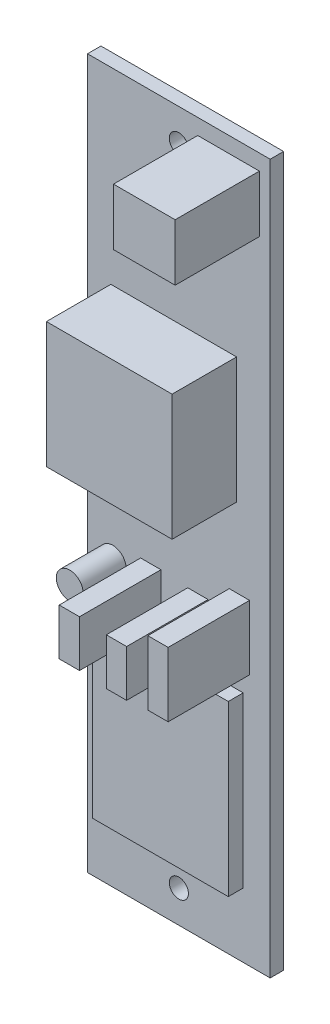
ISO-10303-21;
HEADER;
FILE_DESCRIPTION(('STEP AP214'),'2;1');
FILE_NAME('part.step','',(''),(''),'','','');
FILE_SCHEMA(('AUTOMOTIVE_DESIGN { 1 0 10303 214 1 1 1 1 }'));
ENDSEC;
DATA;
#1=APPLICATION_CONTEXT('core data for automotive mechanical design processes');
#2=APPLICATION_PROTOCOL_DEFINITION('international standard','automotive_design',2000,#1);
#3=PRODUCT_CONTEXT('',#1,'mechanical');
#4=PRODUCT('Part','Part','',(#3));
#5=PRODUCT_RELATED_PRODUCT_CATEGORY('part','',(#4));
#6=PRODUCT_DEFINITION_FORMATION('','',#4);
#7=PRODUCT_DEFINITION_CONTEXT('part definition',#1,'design');
#8=PRODUCT_DEFINITION('design','',#6,#7);
#9=PRODUCT_DEFINITION_SHAPE('','',#8);
#10=(LENGTH_UNIT() NAMED_UNIT(*) SI_UNIT(.MILLI.,.METRE.));
#11=(NAMED_UNIT(*) PLANE_ANGLE_UNIT() SI_UNIT($,.RADIAN.));
#12=(NAMED_UNIT(*) SI_UNIT($,.STERADIAN.) SOLID_ANGLE_UNIT());
#13=UNCERTAINTY_MEASURE_WITH_UNIT(LENGTH_MEASURE(1.E-05),#10,'distance_accuracy_value','');
#14=(GEOMETRIC_REPRESENTATION_CONTEXT(3) GLOBAL_UNCERTAINTY_ASSIGNED_CONTEXT((#13)) GLOBAL_UNIT_ASSIGNED_CONTEXT((#10,
#11,#12)) REPRESENTATION_CONTEXT('',''));
#15=CARTESIAN_POINT('',(0.,0.,0.));
#16=DIRECTION('',(0.,0.,1.));
#17=DIRECTION('',(1.,0.,0.));
#18=AXIS2_PLACEMENT_3D('',#15,#16,#17);
#19=CARTESIAN_POINT('',(0.,0.,1.5875));
#20=DIRECTION('',(0.,0.,1.));
#21=DIRECTION('',(1.,0.,0.));
#22=AXIS2_PLACEMENT_3D('',#19,#20,#21);
#23=PLANE('',#22);
#24=CARTESIAN_POINT('',(0.,-38.1,1.5875));
#25=DIRECTION('',(0.,0.,1.));
#26=DIRECTION('',(1.,0.,0.));
#27=AXIS2_PLACEMENT_3D('',#24,#25,#26);
#28=CIRCLE('',#27,1.13029999999999);
#29=CARTESIAN_POINT('',(1.13029999999998,-38.1,1.5875));
#30=VERTEX_POINT('',#29);
#31=EDGE_CURVE('E591',#30,#30,#28,.T.);
#32=ORIENTED_EDGE('',*,*,#31,.F.);
#33=EDGE_LOOP('',(#32));
#34=FACE_BOUND('',#33,.T.);
#35=CARTESIAN_POINT('',(0.,38.1,1.5875));
#36=DIRECTION('',(0.,0.,1.));
#37=DIRECTION('',(1.,0.,0.));
#38=AXIS2_PLACEMENT_3D('',#35,#36,#37);
#39=CIRCLE('',#38,1.13029999999999);
#40=CARTESIAN_POINT('',(1.13029999999998,38.1,1.5875));
#41=VERTEX_POINT('',#40);
#42=EDGE_CURVE('E37',#41,#41,#39,.T.);
#43=ORIENTED_EDGE('',*,*,#42,.F.);
#44=EDGE_LOOP('',(#43));
#45=FACE_BOUND('',#44,.T.);
#46=CARTESIAN_POINT('',(-7.81625602394342,-8.50009266287089,1.5875));
#47=DIRECTION('',(0.,0.,1.));
#48=DIRECTION('',(1.,0.,0.));
#49=AXIS2_PLACEMENT_3D('',#46,#47,#48);
#50=CIRCLE('',#49,1.5875);
#51=CARTESIAN_POINT('',(-6.22875602394342,-8.50009266287089,1.5875));
#52=VERTEX_POINT('',#51);
#53=EDGE_CURVE('E11',#52,#52,#50,.T.);
#54=ORIENTED_EDGE('',*,*,#53,.F.);
#55=EDGE_LOOP('',(#54));
#56=FACE_BOUND('',#55,.T.);
#57=DIRECTION('',(1.,0.,0.));
#58=VECTOR('',#57,1.);
#59=CARTESIAN_POINT('',(-10.795,-41.91,1.5875));
#60=LINE('',#59,#58);
#61=CARTESIAN_POINT('',(-10.795,-41.91,1.5875));
#62=VERTEX_POINT('',#61);
#63=CARTESIAN_POINT('',(10.795,-41.91,1.5875));
#64=VERTEX_POINT('',#63);
#65=EDGE_CURVE('E392',#62,#64,#60,.T.);
#66=ORIENTED_EDGE('',*,*,#65,.T.);
#67=DIRECTION('',(0.,1.,0.));
#68=VECTOR('',#67,1.);
#69=CARTESIAN_POINT('',(10.795,-41.91,1.5875));
#70=LINE('',#69,#68);
#71=CARTESIAN_POINT('',(10.795,41.91,1.5875));
#72=VERTEX_POINT('',#71);
#73=EDGE_CURVE('E409',#64,#72,#70,.T.);
#74=ORIENTED_EDGE('',*,*,#73,.T.);
#75=DIRECTION('',(-1.,0.,0.));
#76=VECTOR('',#75,1.);
#77=CARTESIAN_POINT('',(10.795,41.91,1.5875));
#78=LINE('',#77,#76);
#79=CARTESIAN_POINT('',(-10.795,41.91,1.5875));
#80=VERTEX_POINT('',#79);
#81=EDGE_CURVE('E412',#72,#80,#78,.T.);
#82=ORIENTED_EDGE('',*,*,#81,.T.);
#83=DIRECTION('',(0.,-1.,0.));
#84=VECTOR('',#83,1.);
#85=CARTESIAN_POINT('',(-10.795,41.91,1.5875));
#86=LINE('',#85,#84);
#87=EDGE_CURVE('E397',#80,#62,#86,.T.);
#88=ORIENTED_EDGE('',*,*,#87,.T.);
#89=EDGE_LOOP('',(#66,#74,#82,#88));
#90=FACE_BOUND('',#89,.T.);
#91=DIRECTION('',(0.,-1.,0.));
#92=VECTOR('',#91,1.);
#93=CARTESIAN_POINT('',(2.23071803338825,33.3498351508618,1.5875));
#94=LINE('',#93,#92);
#95=CARTESIAN_POINT('',(2.23071803338825,40.0554351508618,1.5875));
#96=VERTEX_POINT('',#95);
#97=CARTESIAN_POINT('',(2.23071803338825,33.3498351508618,1.5875));
#98=VERTEX_POINT('',#97);
#99=EDGE_CURVE('E377',#96,#98,#94,.T.);
#100=ORIENTED_EDGE('',*,*,#99,.F.);
#101=DIRECTION('',(-1.,0.,0.));
#102=VECTOR('',#101,1.);
#103=CARTESIAN_POINT('',(2.23071803338825,40.0554351508618,1.5875));
#104=LINE('',#103,#102);
#105=CARTESIAN_POINT('',(9.52051803338826,40.0554351508618,1.5875));
#106=VERTEX_POINT('',#105);
#107=EDGE_CURVE('E363',#106,#96,#104,.T.);
#108=ORIENTED_EDGE('',*,*,#107,.F.);
#109=DIRECTION('',(0.,1.,0.));
#110=VECTOR('',#109,1.);
#111=CARTESIAN_POINT('',(9.52051803338826,40.0554351508618,1.5875));
#112=LINE('',#111,#110);
#113=CARTESIAN_POINT('',(9.52051803338826,33.3498351508618,1.5875));
#114=VERTEX_POINT('',#113);
#115=EDGE_CURVE('E368',#114,#106,#112,.T.);
#116=ORIENTED_EDGE('',*,*,#115,.F.);
#117=DIRECTION('',(1.,0.,0.));
#118=VECTOR('',#117,1.);
#119=CARTESIAN_POINT('',(9.52051803338826,33.3498351508618,1.5875));
#120=LINE('',#119,#118);
#121=EDGE_CURVE('E379',#98,#114,#120,.T.);
#122=ORIENTED_EDGE('',*,*,#121,.F.);
#123=EDGE_LOOP('',(#100,#108,#116,#122));
#124=FACE_BOUND('',#123,.T.);
#125=DIRECTION('',(1.,0.,0.));
#126=VECTOR('',#125,1.);
#127=CARTESIAN_POINT('',(6.82413835340738,4.82599996030331,1.5875));
#128=LINE('',#127,#126);
#129=CARTESIAN_POINT('',(-8.03486164659262,4.82599996030331,1.5875));
#130=VERTEX_POINT('',#129);
#131=CARTESIAN_POINT('',(6.82413835340738,4.82599996030331,1.5875));
#132=VERTEX_POINT('',#131);
#133=EDGE_CURVE('E348',#130,#132,#128,.T.);
#134=ORIENTED_EDGE('',*,*,#133,.F.);
#135=DIRECTION('',(0.,-1.,0.));
#136=VECTOR('',#135,1.);
#137=CARTESIAN_POINT('',(-8.03486164659262,4.82599996030331,1.5875));
#138=LINE('',#137,#136);
#139=CARTESIAN_POINT('',(-8.03486164659262,19.6849999603033,1.5875));
#140=VERTEX_POINT('',#139);
#141=EDGE_CURVE('E334',#140,#130,#138,.T.);
#142=ORIENTED_EDGE('',*,*,#141,.F.);
#143=DIRECTION('',(-1.,0.,0.));
#144=VECTOR('',#143,1.);
#145=CARTESIAN_POINT('',(-8.03486164659262,19.6849999603033,1.5875));
#146=LINE('',#145,#144);
#147=CARTESIAN_POINT('',(6.82413835340738,19.6849999603033,1.5875));
#148=VERTEX_POINT('',#147);
#149=EDGE_CURVE('E339',#148,#140,#146,.T.);
#150=ORIENTED_EDGE('',*,*,#149,.F.);
#151=DIRECTION('',(0.,1.,0.));
#152=VECTOR('',#151,1.);
#153=CARTESIAN_POINT('',(6.82413835340738,19.6849999603033,1.5875));
#154=LINE('',#153,#152);
#155=EDGE_CURVE('E350',#132,#148,#154,.T.);
#156=ORIENTED_EDGE('',*,*,#155,.F.);
#157=EDGE_LOOP('',(#134,#142,#150,#156));
#158=FACE_BOUND('',#157,.T.);
#159=DIRECTION('',(0.,-1.,0.));
#160=VECTOR('',#159,1.);
#161=CARTESIAN_POINT('',(-8.44348501414061,-34.2900007963181,1.5875));
#162=LINE('',#161,#160);
#163=CARTESIAN_POINT('',(-8.44348501414061,-14.3129007963181,1.5875));
#164=VERTEX_POINT('',#163);
#165=CARTESIAN_POINT('',(-8.44348501414061,-34.2900007963181,1.5875));
#166=VERTEX_POINT('',#165);
#167=EDGE_CURVE('E319',#164,#166,#162,.T.);
#168=ORIENTED_EDGE('',*,*,#167,.F.);
#169=DIRECTION('',(-1.,0.,0.));
#170=VECTOR('',#169,1.);
#171=CARTESIAN_POINT('',(-8.44348501414061,-14.3129007963181,1.5875));
#172=LINE('',#171,#170);
#173=CARTESIAN_POINT('',(7.60931498585939,-14.3129007963181,1.5875));
#174=VERTEX_POINT('',#173);
#175=EDGE_CURVE('E305',#174,#164,#172,.T.);
#176=ORIENTED_EDGE('',*,*,#175,.F.);
#177=DIRECTION('',(0.,1.,0.));
#178=VECTOR('',#177,1.);
#179=CARTESIAN_POINT('',(7.60931498585939,-14.3129007963181,1.5875));
#180=LINE('',#179,#178);
#181=CARTESIAN_POINT('',(7.60931498585939,-34.2900007963181,1.5875));
#182=VERTEX_POINT('',#181);
#183=EDGE_CURVE('E310',#182,#174,#180,.T.);
#184=ORIENTED_EDGE('',*,*,#183,.F.);
#185=DIRECTION('',(1.,0.,0.));
#186=VECTOR('',#185,1.);
#187=CARTESIAN_POINT('',(7.60931498585939,-34.2900007963181,1.5875));
#188=LINE('',#187,#186);
#189=EDGE_CURVE('E321',#166,#182,#188,.T.);
#190=ORIENTED_EDGE('',*,*,#189,.F.);
#191=EDGE_LOOP('',(#168,#176,#184,#190));
#192=FACE_BOUND('',#191,.T.);
#193=DIRECTION('',(0.,-1.,0.));
#194=VECTOR('',#193,1.);
#195=CARTESIAN_POINT('',(5.95981317727992,-12.0904,1.5875));
#196=LINE('',#195,#194);
#197=CARTESIAN_POINT('',(5.95981317727992,-4.4704,1.5875));
#198=VERTEX_POINT('',#197);
#199=CARTESIAN_POINT('',(5.95981317727992,-12.0904,1.5875));
#200=VERTEX_POINT('',#199);
#201=EDGE_CURVE('E290',#198,#200,#196,.T.);
#202=ORIENTED_EDGE('',*,*,#201,.F.);
#203=DIRECTION('',(-1.,0.,0.));
#204=VECTOR('',#203,1.);
#205=CARTESIAN_POINT('',(5.95981317727992,-4.4704,1.5875));
#206=LINE('',#205,#204);
#207=CARTESIAN_POINT('',(8.36011317727992,-4.4704,1.5875));
#208=VERTEX_POINT('',#207);
#209=EDGE_CURVE('E276',#208,#198,#206,.T.);
#210=ORIENTED_EDGE('',*,*,#209,.F.);
#211=DIRECTION('',(0.,1.,0.));
#212=VECTOR('',#211,1.);
#213=CARTESIAN_POINT('',(8.36011317727992,-4.4704,1.5875));
#214=LINE('',#213,#212);
#215=CARTESIAN_POINT('',(8.36011317727992,-12.0904,1.5875));
#216=VERTEX_POINT('',#215);
#217=EDGE_CURVE('E281',#216,#208,#214,.T.);
#218=ORIENTED_EDGE('',*,*,#217,.F.);
#219=DIRECTION('',(1.,0.,0.));
#220=VECTOR('',#219,1.);
#221=CARTESIAN_POINT('',(8.36011317727992,-12.0904,1.5875));
#222=LINE('',#221,#220);
#223=EDGE_CURVE('E292',#200,#216,#222,.T.);
#224=ORIENTED_EDGE('',*,*,#223,.F.);
#225=EDGE_LOOP('',(#202,#210,#218,#224));
#226=FACE_BOUND('',#225,.T.);
#227=DIRECTION('',(0.,-1.,0.));
#228=VECTOR('',#227,1.);
#229=CARTESIAN_POINT('',(1.05358666249026,-12.3454406298988,1.5875));
#230=LINE('',#229,#228);
#231=CARTESIAN_POINT('',(1.05358666249026,-6.83364062989885,1.5875));
#232=VERTEX_POINT('',#231);
#233=CARTESIAN_POINT('',(1.05358666249026,-12.3454406298988,1.5875));
#234=VERTEX_POINT('',#233);
#235=EDGE_CURVE('E248',#232,#234,#230,.T.);
#236=ORIENTED_EDGE('',*,*,#235,.F.);
#237=DIRECTION('',(-1.,0.,0.));
#238=VECTOR('',#237,1.);
#239=CARTESIAN_POINT('',(1.05358666249026,-6.83364062989885,1.5875));
#240=LINE('',#239,#238);
#241=CARTESIAN_POINT('',(3.45388666249026,-6.83364062989885,1.5875));
#242=VERTEX_POINT('',#241);
#243=EDGE_CURVE('E245',#242,#232,#240,.T.);
#244=ORIENTED_EDGE('',*,*,#243,.F.);
#245=DIRECTION('',(0.,1.,0.));
#246=VECTOR('',#245,1.);
#247=CARTESIAN_POINT('',(3.45388666249026,-6.83364062989885,1.5875));
#248=LINE('',#247,#246);
#249=CARTESIAN_POINT('',(3.45388666249026,-12.3454406298988,1.5875));
#250=VERTEX_POINT('',#249);
#251=EDGE_CURVE('E257',#250,#242,#248,.T.);
#252=ORIENTED_EDGE('',*,*,#251,.F.);
#253=DIRECTION('',(1.,0.,0.));
#254=VECTOR('',#253,1.);
#255=CARTESIAN_POINT('',(3.45388666249026,-12.3454406298988,1.5875));
#256=LINE('',#255,#254);
#257=EDGE_CURVE('E265',#234,#250,#256,.T.);
#258=ORIENTED_EDGE('',*,*,#257,.F.);
#259=EDGE_LOOP('',(#236,#244,#252,#258));
#260=FACE_BOUND('',#259,.T.);
#261=DIRECTION('',(0.,-1.,0.));
#262=VECTOR('',#261,1.);
#263=CARTESIAN_POINT('',(-4.51653554604767,-12.0820751285927,1.5875));
#264=LINE('',#263,#262);
#265=CARTESIAN_POINT('',(-4.51653554604767,-6.5702751285927,1.5875));
#266=VERTEX_POINT('',#265);
#267=CARTESIAN_POINT('',(-4.51653554604767,-12.0820751285927,1.5875));
#268=VERTEX_POINT('',#267);
#269=EDGE_CURVE('E608',#266,#268,#264,.T.);
#270=ORIENTED_EDGE('',*,*,#269,.F.);
#271=DIRECTION('',(-1.,0.,0.));
#272=VECTOR('',#271,1.);
#273=CARTESIAN_POINT('',(-4.51653554604767,-6.5702751285927,1.5875));
#274=LINE('',#273,#272);
#275=CARTESIAN_POINT('',(-2.11623554604767,-6.5702751285927,1.5875));
#276=VERTEX_POINT('',#275);
#277=EDGE_CURVE('E243',#276,#266,#274,.T.);
#278=ORIENTED_EDGE('',*,*,#277,.F.);
#279=DIRECTION('',(0.,1.,0.));
#280=VECTOR('',#279,1.);
#281=CARTESIAN_POINT('',(-2.11623554604767,-6.5702751285927,1.5875));
#282=LINE('',#281,#280);
#283=CARTESIAN_POINT('',(-2.11623554604767,-12.0820751285927,1.5875));
#284=VERTEX_POINT('',#283);
#285=EDGE_CURVE('E239',#284,#276,#282,.T.);
#286=ORIENTED_EDGE('',*,*,#285,.F.);
#287=DIRECTION('',(1.,0.,0.));
#288=VECTOR('',#287,1.);
#289=CARTESIAN_POINT('',(-2.11623554604767,-12.0820751285927,1.5875));
#290=LINE('',#289,#288);
#291=EDGE_CURVE('E610',#268,#284,#290,.T.);
#292=ORIENTED_EDGE('',*,*,#291,.F.);
#293=EDGE_LOOP('',(#270,#278,#286,#292));
#294=FACE_BOUND('',#293,.T.);
#295=ADVANCED_FACE('F33',(#34,#45,#56,#90,#124,#158,#192,#226,#260,#294),#23,.T.);
#296=CARTESIAN_POINT('',(-10.795,-41.91,0.));
#297=DIRECTION('',(0.,-1.,0.));
#298=DIRECTION('',(0.,0.,-1.));
#299=AXIS2_PLACEMENT_3D('',#296,#297,#298);
#300=PLANE('',#299);
#301=ORIENTED_EDGE('',*,*,#65,.F.);
#302=DIRECTION('',(0.,0.,1.));
#303=VECTOR('',#302,1.);
#304=CARTESIAN_POINT('',(-10.795,-41.91,0.));
#305=LINE('',#304,#303);
#306=CARTESIAN_POINT('',(-10.795,-41.91,0.));
#307=VERTEX_POINT('',#306);
#308=EDGE_CURVE('E42',#307,#62,#305,.T.);
#309=ORIENTED_EDGE('',*,*,#308,.F.);
#310=DIRECTION('',(1.,0.,0.));
#311=VECTOR('',#310,1.);
#312=CARTESIAN_POINT('',(-10.795,-41.91,0.));
#313=LINE('',#312,#311);
#314=CARTESIAN_POINT('',(10.795,-41.91,0.));
#315=VERTEX_POINT('',#314);
#316=EDGE_CURVE('E393',#307,#315,#313,.T.);
#317=ORIENTED_EDGE('',*,*,#316,.T.);
#318=DIRECTION('',(0.,0.,1.));
#319=VECTOR('',#318,1.);
#320=CARTESIAN_POINT('',(10.795,-41.91,0.));
#321=LINE('',#320,#319);
#322=EDGE_CURVE('E406',#315,#64,#321,.T.);
#323=ORIENTED_EDGE('',*,*,#322,.T.);
#324=EDGE_LOOP('',(#301,#309,#317,#323));
#325=FACE_BOUND('',#324,.T.);
#326=ADVANCED_FACE('F35',(#325),#300,.T.);
#327=CARTESIAN_POINT('',(-10.795,41.91,0.));
#328=DIRECTION('',(-1.,0.,0.));
#329=DIRECTION('',(0.,0.,1.));
#330=AXIS2_PLACEMENT_3D('',#327,#328,#329);
#331=PLANE('',#330);
#332=ORIENTED_EDGE('',*,*,#87,.F.);
#333=DIRECTION('',(0.,0.,1.));
#334=VECTOR('',#333,1.);
#335=CARTESIAN_POINT('',(-10.795,41.91,0.));
#336=LINE('',#335,#334);
#337=CARTESIAN_POINT('',(-10.795,41.91,0.));
#338=VERTEX_POINT('',#337);
#339=EDGE_CURVE('E418',#338,#80,#336,.T.);
#340=ORIENTED_EDGE('',*,*,#339,.F.);
#341=DIRECTION('',(0.,-1.,0.));
#342=VECTOR('',#341,1.);
#343=CARTESIAN_POINT('',(-10.795,41.91,0.));
#344=LINE('',#343,#342);
#345=EDGE_CURVE('E403',#338,#307,#344,.T.);
#346=ORIENTED_EDGE('',*,*,#345,.T.);
#347=ORIENTED_EDGE('',*,*,#308,.T.);
#348=EDGE_LOOP('',(#332,#340,#346,#347));
#349=FACE_BOUND('',#348,.T.);
#350=ADVANCED_FACE('F434',(#349),#331,.T.);
#351=CARTESIAN_POINT('',(10.795,41.91,0.));
#352=DIRECTION('',(0.,1.,0.));
#353=DIRECTION('',(0.,0.,1.));
#354=AXIS2_PLACEMENT_3D('',#351,#352,#353);
#355=PLANE('',#354);
#356=ORIENTED_EDGE('',*,*,#81,.F.);
#357=DIRECTION('',(0.,0.,1.));
#358=VECTOR('',#357,1.);
#359=CARTESIAN_POINT('',(10.795,41.91,0.));
#360=LINE('',#359,#358);
#361=CARTESIAN_POINT('',(10.795,41.91,0.));
#362=VERTEX_POINT('',#361);
#363=EDGE_CURVE('E420',#362,#72,#360,.T.);
#364=ORIENTED_EDGE('',*,*,#363,.F.);
#365=DIRECTION('',(-1.,0.,0.));
#366=VECTOR('',#365,1.);
#367=CARTESIAN_POINT('',(10.795,41.91,0.));
#368=LINE('',#367,#366);
#369=EDGE_CURVE('E400',#362,#338,#368,.T.);
#370=ORIENTED_EDGE('',*,*,#369,.T.);
#371=ORIENTED_EDGE('',*,*,#339,.T.);
#372=EDGE_LOOP('',(#356,#364,#370,#371));
#373=FACE_BOUND('',#372,.T.);
#374=ADVANCED_FACE('F440',(#373),#355,.T.);
#375=CARTESIAN_POINT('',(10.795,-41.91,0.));
#376=DIRECTION('',(1.,0.,0.));
#377=DIRECTION('',(0.,0.,-1.));
#378=AXIS2_PLACEMENT_3D('',#375,#376,#377);
#379=PLANE('',#378);
#380=ORIENTED_EDGE('',*,*,#73,.F.);
#381=ORIENTED_EDGE('',*,*,#322,.F.);
#382=DIRECTION('',(0.,1.,0.));
#383=VECTOR('',#382,1.);
#384=CARTESIAN_POINT('',(10.795,-41.91,0.));
#385=LINE('',#384,#383);
#386=EDGE_CURVE('E396',#315,#362,#385,.T.);
#387=ORIENTED_EDGE('',*,*,#386,.T.);
#388=ORIENTED_EDGE('',*,*,#363,.T.);
#389=EDGE_LOOP('',(#380,#381,#387,#388));
#390=FACE_BOUND('',#389,.T.);
#391=ADVANCED_FACE('F428',(#390),#379,.T.);
#392=CARTESIAN_POINT('',(0.,0.,0.));
#393=DIRECTION('',(0.,0.,1.));
#394=DIRECTION('',(1.,0.,0.));
#395=AXIS2_PLACEMENT_3D('',#392,#393,#394);
#396=PLANE('',#395);
#397=CARTESIAN_POINT('',(0.,-38.1,0.));
#398=DIRECTION('',(0.,0.,-1.));
#399=DIRECTION('',(-1.,0.,0.));
#400=AXIS2_PLACEMENT_3D('',#397,#398,#399);
#401=CIRCLE('',#400,1.13029999999999);
#402=CARTESIAN_POINT('',(-1.13029999999999,-38.1,0.));
#403=VERTEX_POINT('',#402);
#404=EDGE_CURVE('E594',#403,#403,#401,.T.);
#405=ORIENTED_EDGE('',*,*,#404,.F.);
#406=EDGE_LOOP('',(#405));
#407=FACE_BOUND('',#406,.T.);
#408=CARTESIAN_POINT('',(0.,38.1,0.));
#409=DIRECTION('',(0.,0.,-1.));
#410=DIRECTION('',(-1.,0.,0.));
#411=AXIS2_PLACEMENT_3D('',#408,#409,#410);
#412=CIRCLE('',#411,1.13029999999999);
#413=CARTESIAN_POINT('',(-1.13029999999999,38.1,0.));
#414=VERTEX_POINT('',#413);
#415=EDGE_CURVE('E596',#414,#414,#412,.T.);
#416=ORIENTED_EDGE('',*,*,#415,.F.);
#417=EDGE_LOOP('',(#416));
#418=FACE_BOUND('',#417,.T.);
#419=ORIENTED_EDGE('',*,*,#316,.F.);
#420=ORIENTED_EDGE('',*,*,#345,.F.);
#421=ORIENTED_EDGE('',*,*,#369,.F.);
#422=ORIENTED_EDGE('',*,*,#386,.F.);
#423=EDGE_LOOP('',(#419,#420,#421,#422));
#424=FACE_BOUND('',#423,.T.);
#425=ADVANCED_FACE('F437',(#407,#418,#424),#396,.F.);
#426=CARTESIAN_POINT('',(2.23071803338825,40.0554351508618,11.5443));
#427=DIRECTION('',(0.,-1.,0.));
#428=DIRECTION('',(0.,0.,-1.));
#429=AXIS2_PLACEMENT_3D('',#426,#427,#428);
#430=PLANE('',#429);
#431=ORIENTED_EDGE('',*,*,#107,.T.);
#432=DIRECTION('',(0.,0.,-1.));
#433=VECTOR('',#432,1.);
#434=CARTESIAN_POINT('',(2.23071803338825,40.0554351508618,11.5443));
#435=LINE('',#434,#433);
#436=CARTESIAN_POINT('',(2.23071803338825,40.0554351508618,11.5443));
#437=VERTEX_POINT('',#436);
#438=EDGE_CURVE('E390',#437,#96,#435,.T.);
#439=ORIENTED_EDGE('',*,*,#438,.F.);
#440=DIRECTION('',(-1.,0.,0.));
#441=VECTOR('',#440,1.);
#442=CARTESIAN_POINT('',(2.23071803338825,40.0554351508618,11.5443));
#443=LINE('',#442,#441);
#444=CARTESIAN_POINT('',(9.52051803338826,40.0554351508618,11.5443));
#445=VERTEX_POINT('',#444);
#446=EDGE_CURVE('E364',#445,#437,#443,.T.);
#447=ORIENTED_EDGE('',*,*,#446,.F.);
#448=DIRECTION('',(0.,0.,-1.));
#449=VECTOR('',#448,1.);
#450=CARTESIAN_POINT('',(9.52051803338826,40.0554351508618,11.5443));
#451=LINE('',#450,#449);
#452=EDGE_CURVE('E374',#445,#106,#451,.T.);
#453=ORIENTED_EDGE('',*,*,#452,.T.);
#454=EDGE_LOOP('',(#431,#439,#447,#453));
#455=FACE_BOUND('',#454,.T.);
#456=ADVANCED_FACE('F459',(#455),#430,.F.);
#457=CARTESIAN_POINT('',(2.23071803338825,33.3498351508618,11.5443));
#458=DIRECTION('',(1.,0.,0.));
#459=DIRECTION('',(0.,0.,-1.));
#460=AXIS2_PLACEMENT_3D('',#457,#458,#459);
#461=PLANE('',#460);
#462=ORIENTED_EDGE('',*,*,#99,.T.);
#463=DIRECTION('',(0.,0.,-1.));
#464=VECTOR('',#463,1.);
#465=CARTESIAN_POINT('',(2.23071803338825,33.3498351508618,11.5443));
#466=LINE('',#465,#464);
#467=CARTESIAN_POINT('',(2.23071803338825,33.3498351508618,11.5443));
#468=VERTEX_POINT('',#467);
#469=EDGE_CURVE('E387',#468,#98,#466,.T.);
#470=ORIENTED_EDGE('',*,*,#469,.F.);
#471=DIRECTION('',(0.,-1.,0.));
#472=VECTOR('',#471,1.);
#473=CARTESIAN_POINT('',(2.23071803338825,33.3498351508618,11.5443));
#474=LINE('',#473,#472);
#475=EDGE_CURVE('E367',#437,#468,#474,.T.);
#476=ORIENTED_EDGE('',*,*,#475,.F.);
#477=ORIENTED_EDGE('',*,*,#438,.T.);
#478=EDGE_LOOP('',(#462,#470,#476,#477));
#479=FACE_BOUND('',#478,.T.);
#480=ADVANCED_FACE('F463',(#479),#461,.F.);
#481=CARTESIAN_POINT('',(9.52051803338826,33.3498351508618,11.5443));
#482=DIRECTION('',(0.,1.,0.));
#483=DIRECTION('',(0.,0.,1.));
#484=AXIS2_PLACEMENT_3D('',#481,#482,#483);
#485=PLANE('',#484);
#486=ORIENTED_EDGE('',*,*,#121,.T.);
#487=DIRECTION('',(0.,0.,-1.));
#488=VECTOR('',#487,1.);
#489=CARTESIAN_POINT('',(9.52051803338826,33.3498351508618,11.5443));
#490=LINE('',#489,#488);
#491=CARTESIAN_POINT('',(9.52051803338826,33.3498351508618,11.5443));
#492=VERTEX_POINT('',#491);
#493=EDGE_CURVE('E385',#492,#114,#490,.T.);
#494=ORIENTED_EDGE('',*,*,#493,.F.);
#495=DIRECTION('',(1.,0.,0.));
#496=VECTOR('',#495,1.);
#497=CARTESIAN_POINT('',(9.52051803338826,33.3498351508618,11.5443));
#498=LINE('',#497,#496);
#499=EDGE_CURVE('E370',#468,#492,#498,.T.);
#500=ORIENTED_EDGE('',*,*,#499,.F.);
#501=ORIENTED_EDGE('',*,*,#469,.T.);
#502=EDGE_LOOP('',(#486,#494,#500,#501));
#503=FACE_BOUND('',#502,.T.);
#504=ADVANCED_FACE('F467',(#503),#485,.F.);
#505=CARTESIAN_POINT('',(9.52051803338826,40.0554351508618,11.5443));
#506=DIRECTION('',(-1.,0.,0.));
#507=DIRECTION('',(0.,0.,1.));
#508=AXIS2_PLACEMENT_3D('',#505,#506,#507);
#509=PLANE('',#508);
#510=ORIENTED_EDGE('',*,*,#115,.T.);
#511=ORIENTED_EDGE('',*,*,#452,.F.);
#512=DIRECTION('',(0.,1.,0.));
#513=VECTOR('',#512,1.);
#514=CARTESIAN_POINT('',(9.52051803338826,40.0554351508618,11.5443));
#515=LINE('',#514,#513);
#516=EDGE_CURVE('E372',#492,#445,#515,.T.);
#517=ORIENTED_EDGE('',*,*,#516,.F.);
#518=ORIENTED_EDGE('',*,*,#493,.T.);
#519=EDGE_LOOP('',(#510,#511,#517,#518));
#520=FACE_BOUND('',#519,.T.);
#521=ADVANCED_FACE('F471',(#520),#509,.F.);
#522=CARTESIAN_POINT('',(0.,0.,11.5443));
#523=DIRECTION('',(0.,0.,-1.));
#524=DIRECTION('',(-1.,0.,0.));
#525=AXIS2_PLACEMENT_3D('',#522,#523,#524);
#526=PLANE('',#525);
#527=ORIENTED_EDGE('',*,*,#446,.T.);
#528=ORIENTED_EDGE('',*,*,#475,.T.);
#529=ORIENTED_EDGE('',*,*,#499,.T.);
#530=ORIENTED_EDGE('',*,*,#516,.T.);
#531=EDGE_LOOP('',(#527,#528,#529,#530));
#532=FACE_BOUND('',#531,.T.);
#533=ADVANCED_FACE('F475',(#532),#526,.F.);
#534=CARTESIAN_POINT('',(-8.03486164659262,4.82599996030331,9.2075));
#535=DIRECTION('',(1.,0.,0.));
#536=DIRECTION('',(0.,0.,-1.));
#537=AXIS2_PLACEMENT_3D('',#534,#535,#536);
#538=PLANE('',#537);
#539=ORIENTED_EDGE('',*,*,#141,.T.);
#540=DIRECTION('',(0.,0.,-1.));
#541=VECTOR('',#540,1.);
#542=CARTESIAN_POINT('',(-8.03486164659262,4.82599996030331,9.2075));
#543=LINE('',#542,#541);
#544=CARTESIAN_POINT('',(-8.03486164659262,4.82599996030331,9.2075));
#545=VERTEX_POINT('',#544);
#546=EDGE_CURVE('E361',#545,#130,#543,.T.);
#547=ORIENTED_EDGE('',*,*,#546,.F.);
#548=DIRECTION('',(0.,-1.,0.));
#549=VECTOR('',#548,1.);
#550=CARTESIAN_POINT('',(-8.03486164659262,4.82599996030331,9.2075));
#551=LINE('',#550,#549);
#552=CARTESIAN_POINT('',(-8.03486164659262,19.6849999603033,9.2075));
#553=VERTEX_POINT('',#552);
#554=EDGE_CURVE('E335',#553,#545,#551,.T.);
#555=ORIENTED_EDGE('',*,*,#554,.F.);
#556=DIRECTION('',(0.,0.,-1.));
#557=VECTOR('',#556,1.);
#558=CARTESIAN_POINT('',(-8.03486164659262,19.6849999603033,9.2075));
#559=LINE('',#558,#557);
#560=EDGE_CURVE('E345',#553,#140,#559,.T.);
#561=ORIENTED_EDGE('',*,*,#560,.T.);
#562=EDGE_LOOP('',(#539,#547,#555,#561));
#563=FACE_BOUND('',#562,.T.);
#564=ADVANCED_FACE('F479',(#563),#538,.F.);
#565=CARTESIAN_POINT('',(6.82413835340738,4.82599996030331,9.2075));
#566=DIRECTION('',(0.,1.,0.));
#567=DIRECTION('',(0.,0.,1.));
#568=AXIS2_PLACEMENT_3D('',#565,#566,#567);
#569=PLANE('',#568);
#570=ORIENTED_EDGE('',*,*,#133,.T.);
#571=DIRECTION('',(0.,0.,-1.));
#572=VECTOR('',#571,1.);
#573=CARTESIAN_POINT('',(6.82413835340738,4.82599996030331,9.2075));
#574=LINE('',#573,#572);
#575=CARTESIAN_POINT('',(6.82413835340738,4.82599996030331,9.2075));
#576=VERTEX_POINT('',#575);
#577=EDGE_CURVE('E358',#576,#132,#574,.T.);
#578=ORIENTED_EDGE('',*,*,#577,.F.);
#579=DIRECTION('',(1.,0.,0.));
#580=VECTOR('',#579,1.);
#581=CARTESIAN_POINT('',(6.82413835340738,4.82599996030331,9.2075));
#582=LINE('',#581,#580);
#583=EDGE_CURVE('E338',#545,#576,#582,.T.);
#584=ORIENTED_EDGE('',*,*,#583,.F.);
#585=ORIENTED_EDGE('',*,*,#546,.T.);
#586=EDGE_LOOP('',(#570,#578,#584,#585));
#587=FACE_BOUND('',#586,.T.);
#588=ADVANCED_FACE('F483',(#587),#569,.F.);
#589=CARTESIAN_POINT('',(6.82413835340738,19.6849999603033,9.2075));
#590=DIRECTION('',(-1.,0.,0.));
#591=DIRECTION('',(0.,0.,1.));
#592=AXIS2_PLACEMENT_3D('',#589,#590,#591);
#593=PLANE('',#592);
#594=ORIENTED_EDGE('',*,*,#155,.T.);
#595=DIRECTION('',(0.,0.,-1.));
#596=VECTOR('',#595,1.);
#597=CARTESIAN_POINT('',(6.82413835340738,19.6849999603033,9.2075));
#598=LINE('',#597,#596);
#599=CARTESIAN_POINT('',(6.82413835340738,19.6849999603033,9.2075));
#600=VERTEX_POINT('',#599);
#601=EDGE_CURVE('E356',#600,#148,#598,.T.);
#602=ORIENTED_EDGE('',*,*,#601,.F.);
#603=DIRECTION('',(0.,1.,0.));
#604=VECTOR('',#603,1.);
#605=CARTESIAN_POINT('',(6.82413835340738,19.6849999603033,9.2075));
#606=LINE('',#605,#604);
#607=EDGE_CURVE('E341',#576,#600,#606,.T.);
#608=ORIENTED_EDGE('',*,*,#607,.F.);
#609=ORIENTED_EDGE('',*,*,#577,.T.);
#610=EDGE_LOOP('',(#594,#602,#608,#609));
#611=FACE_BOUND('',#610,.T.);
#612=ADVANCED_FACE('F487',(#611),#593,.F.);
#613=CARTESIAN_POINT('',(-8.03486164659262,19.6849999603033,9.2075));
#614=DIRECTION('',(0.,-1.,0.));
#615=DIRECTION('',(0.,0.,-1.));
#616=AXIS2_PLACEMENT_3D('',#613,#614,#615);
#617=PLANE('',#616);
#618=ORIENTED_EDGE('',*,*,#149,.T.);
#619=ORIENTED_EDGE('',*,*,#560,.F.);
#620=DIRECTION('',(-1.,0.,0.));
#621=VECTOR('',#620,1.);
#622=CARTESIAN_POINT('',(-8.03486164659262,19.6849999603033,9.2075));
#623=LINE('',#622,#621);
#624=EDGE_CURVE('E343',#600,#553,#623,.T.);
#625=ORIENTED_EDGE('',*,*,#624,.F.);
#626=ORIENTED_EDGE('',*,*,#601,.T.);
#627=EDGE_LOOP('',(#618,#619,#625,#626));
#628=FACE_BOUND('',#627,.T.);
#629=ADVANCED_FACE('F491',(#628),#617,.F.);
#630=CARTESIAN_POINT('',(0.,0.,9.2075));
#631=DIRECTION('',(0.,0.,-1.));
#632=DIRECTION('',(-1.,0.,0.));
#633=AXIS2_PLACEMENT_3D('',#630,#631,#632);
#634=PLANE('',#633);
#635=ORIENTED_EDGE('',*,*,#554,.T.);
#636=ORIENTED_EDGE('',*,*,#583,.T.);
#637=ORIENTED_EDGE('',*,*,#607,.T.);
#638=ORIENTED_EDGE('',*,*,#624,.T.);
#639=EDGE_LOOP('',(#635,#636,#637,#638));
#640=FACE_BOUND('',#639,.T.);
#641=ADVANCED_FACE('F495',(#640),#634,.F.);
#642=CARTESIAN_POINT('',(-8.44348501414061,-14.3129007963181,3.3528));
#643=DIRECTION('',(0.,-1.,0.));
#644=DIRECTION('',(0.,0.,-1.));
#645=AXIS2_PLACEMENT_3D('',#642,#643,#644);
#646=PLANE('',#645);
#647=ORIENTED_EDGE('',*,*,#175,.T.);
#648=DIRECTION('',(0.,0.,-1.));
#649=VECTOR('',#648,1.);
#650=CARTESIAN_POINT('',(-8.44348501414061,-14.3129007963181,3.3528));
#651=LINE('',#650,#649);
#652=CARTESIAN_POINT('',(-8.44348501414061,-14.3129007963181,3.3528));
#653=VERTEX_POINT('',#652);
#654=EDGE_CURVE('E332',#653,#164,#651,.T.);
#655=ORIENTED_EDGE('',*,*,#654,.F.);
#656=DIRECTION('',(-1.,0.,0.));
#657=VECTOR('',#656,1.);
#658=CARTESIAN_POINT('',(-8.44348501414061,-14.3129007963181,3.3528));
#659=LINE('',#658,#657);
#660=CARTESIAN_POINT('',(7.60931498585939,-14.3129007963181,3.3528));
#661=VERTEX_POINT('',#660);
#662=EDGE_CURVE('E306',#661,#653,#659,.T.);
#663=ORIENTED_EDGE('',*,*,#662,.F.);
#664=DIRECTION('',(0.,0.,-1.));
#665=VECTOR('',#664,1.);
#666=CARTESIAN_POINT('',(7.60931498585939,-14.3129007963181,3.3528));
#667=LINE('',#666,#665);
#668=EDGE_CURVE('E316',#661,#174,#667,.T.);
#669=ORIENTED_EDGE('',*,*,#668,.T.);
#670=EDGE_LOOP('',(#647,#655,#663,#669));
#671=FACE_BOUND('',#670,.T.);
#672=ADVANCED_FACE('F499',(#671),#646,.F.);
#673=CARTESIAN_POINT('',(-8.44348501414061,-34.2900007963181,3.3528));
#674=DIRECTION('',(1.,0.,0.));
#675=DIRECTION('',(0.,0.,-1.));
#676=AXIS2_PLACEMENT_3D('',#673,#674,#675);
#677=PLANE('',#676);
#678=ORIENTED_EDGE('',*,*,#167,.T.);
#679=DIRECTION('',(0.,0.,-1.));
#680=VECTOR('',#679,1.);
#681=CARTESIAN_POINT('',(-8.44348501414061,-34.2900007963181,3.3528));
#682=LINE('',#681,#680);
#683=CARTESIAN_POINT('',(-8.44348501414061,-34.2900007963181,3.3528));
#684=VERTEX_POINT('',#683);
#685=EDGE_CURVE('E329',#684,#166,#682,.T.);
#686=ORIENTED_EDGE('',*,*,#685,.F.);
#687=DIRECTION('',(0.,-1.,0.));
#688=VECTOR('',#687,1.);
#689=CARTESIAN_POINT('',(-8.44348501414061,-34.2900007963181,3.3528));
#690=LINE('',#689,#688);
#691=EDGE_CURVE('E309',#653,#684,#690,.T.);
#692=ORIENTED_EDGE('',*,*,#691,.F.);
#693=ORIENTED_EDGE('',*,*,#654,.T.);
#694=EDGE_LOOP('',(#678,#686,#692,#693));
#695=FACE_BOUND('',#694,.T.);
#696=ADVANCED_FACE('F503',(#695),#677,.F.);
#697=CARTESIAN_POINT('',(7.60931498585939,-34.2900007963181,3.3528));
#698=DIRECTION('',(0.,1.,0.));
#699=DIRECTION('',(0.,0.,1.));
#700=AXIS2_PLACEMENT_3D('',#697,#698,#699);
#701=PLANE('',#700);
#702=ORIENTED_EDGE('',*,*,#189,.T.);
#703=DIRECTION('',(0.,0.,-1.));
#704=VECTOR('',#703,1.);
#705=CARTESIAN_POINT('',(7.60931498585939,-34.2900007963181,3.3528));
#706=LINE('',#705,#704);
#707=CARTESIAN_POINT('',(7.60931498585939,-34.2900007963181,3.3528));
#708=VERTEX_POINT('',#707);
#709=EDGE_CURVE('E327',#708,#182,#706,.T.);
#710=ORIENTED_EDGE('',*,*,#709,.F.);
#711=DIRECTION('',(1.,0.,0.));
#712=VECTOR('',#711,1.);
#713=CARTESIAN_POINT('',(7.60931498585939,-34.2900007963181,3.3528));
#714=LINE('',#713,#712);
#715=EDGE_CURVE('E312',#684,#708,#714,.T.);
#716=ORIENTED_EDGE('',*,*,#715,.F.);
#717=ORIENTED_EDGE('',*,*,#685,.T.);
#718=EDGE_LOOP('',(#702,#710,#716,#717));
#719=FACE_BOUND('',#718,.T.);
#720=ADVANCED_FACE('F507',(#719),#701,.F.);
#721=CARTESIAN_POINT('',(7.60931498585939,-14.3129007963181,3.3528));
#722=DIRECTION('',(-1.,0.,0.));
#723=DIRECTION('',(0.,0.,1.));
#724=AXIS2_PLACEMENT_3D('',#721,#722,#723);
#725=PLANE('',#724);
#726=ORIENTED_EDGE('',*,*,#183,.T.);
#727=ORIENTED_EDGE('',*,*,#668,.F.);
#728=DIRECTION('',(0.,1.,0.));
#729=VECTOR('',#728,1.);
#730=CARTESIAN_POINT('',(7.60931498585939,-14.3129007963181,3.3528));
#731=LINE('',#730,#729);
#732=EDGE_CURVE('E314',#708,#661,#731,.T.);
#733=ORIENTED_EDGE('',*,*,#732,.F.);
#734=ORIENTED_EDGE('',*,*,#709,.T.);
#735=EDGE_LOOP('',(#726,#727,#733,#734));
#736=FACE_BOUND('',#735,.T.);
#737=ADVANCED_FACE('F511',(#736),#725,.F.);
#738=CARTESIAN_POINT('',(0.,0.,3.3528));
#739=DIRECTION('',(0.,0.,-1.));
#740=DIRECTION('',(-1.,0.,0.));
#741=AXIS2_PLACEMENT_3D('',#738,#739,#740);
#742=PLANE('',#741);
#743=ORIENTED_EDGE('',*,*,#662,.T.);
#744=ORIENTED_EDGE('',*,*,#691,.T.);
#745=ORIENTED_EDGE('',*,*,#715,.T.);
#746=ORIENTED_EDGE('',*,*,#732,.T.);
#747=EDGE_LOOP('',(#743,#744,#745,#746));
#748=FACE_BOUND('',#747,.T.);
#749=ADVANCED_FACE('F515',(#748),#742,.F.);
#750=CARTESIAN_POINT('',(5.95981317727992,-4.4704,11.2141));
#751=DIRECTION('',(0.,-1.,0.));
#752=DIRECTION('',(0.,0.,-1.));
#753=AXIS2_PLACEMENT_3D('',#750,#751,#752);
#754=PLANE('',#753);
#755=ORIENTED_EDGE('',*,*,#209,.T.);
#756=DIRECTION('',(0.,0.,-1.));
#757=VECTOR('',#756,1.);
#758=CARTESIAN_POINT('',(5.95981317727992,-4.4704,11.2141));
#759=LINE('',#758,#757);
#760=CARTESIAN_POINT('',(5.95981317727992,-4.4704,11.2141));
#761=VERTEX_POINT('',#760);
#762=EDGE_CURVE('E303',#761,#198,#759,.T.);
#763=ORIENTED_EDGE('',*,*,#762,.F.);
#764=DIRECTION('',(-1.,0.,0.));
#765=VECTOR('',#764,1.);
#766=CARTESIAN_POINT('',(5.95981317727992,-4.4704,11.2141));
#767=LINE('',#766,#765);
#768=CARTESIAN_POINT('',(8.36011317727992,-4.4704,11.2141));
#769=VERTEX_POINT('',#768);
#770=EDGE_CURVE('E277',#769,#761,#767,.T.);
#771=ORIENTED_EDGE('',*,*,#770,.F.);
#772=DIRECTION('',(0.,0.,-1.));
#773=VECTOR('',#772,1.);
#774=CARTESIAN_POINT('',(8.36011317727992,-4.4704,11.2141));
#775=LINE('',#774,#773);
#776=EDGE_CURVE('E287',#769,#208,#775,.T.);
#777=ORIENTED_EDGE('',*,*,#776,.T.);
#778=EDGE_LOOP('',(#755,#763,#771,#777));
#779=FACE_BOUND('',#778,.T.);
#780=ADVANCED_FACE('F519',(#779),#754,.F.);
#781=CARTESIAN_POINT('',(5.95981317727992,-12.0904,11.2141));
#782=DIRECTION('',(1.,0.,0.));
#783=DIRECTION('',(0.,0.,-1.));
#784=AXIS2_PLACEMENT_3D('',#781,#782,#783);
#785=PLANE('',#784);
#786=ORIENTED_EDGE('',*,*,#201,.T.);
#787=DIRECTION('',(0.,0.,-1.));
#788=VECTOR('',#787,1.);
#789=CARTESIAN_POINT('',(5.95981317727992,-12.0904,11.2141));
#790=LINE('',#789,#788);
#791=CARTESIAN_POINT('',(5.95981317727992,-12.0904,11.2141));
#792=VERTEX_POINT('',#791);
#793=EDGE_CURVE('E300',#792,#200,#790,.T.);
#794=ORIENTED_EDGE('',*,*,#793,.F.);
#795=DIRECTION('',(0.,-1.,0.));
#796=VECTOR('',#795,1.);
#797=CARTESIAN_POINT('',(5.95981317727992,-12.0904,11.2141));
#798=LINE('',#797,#796);
#799=EDGE_CURVE('E280',#761,#792,#798,.T.);
#800=ORIENTED_EDGE('',*,*,#799,.F.);
#801=ORIENTED_EDGE('',*,*,#762,.T.);
#802=EDGE_LOOP('',(#786,#794,#800,#801));
#803=FACE_BOUND('',#802,.T.);
#804=ADVANCED_FACE('F523',(#803),#785,.F.);
#805=CARTESIAN_POINT('',(8.36011317727992,-12.0904,11.2141));
#806=DIRECTION('',(0.,1.,0.));
#807=DIRECTION('',(0.,0.,1.));
#808=AXIS2_PLACEMENT_3D('',#805,#806,#807);
#809=PLANE('',#808);
#810=ORIENTED_EDGE('',*,*,#223,.T.);
#811=DIRECTION('',(0.,0.,-1.));
#812=VECTOR('',#811,1.);
#813=CARTESIAN_POINT('',(8.36011317727992,-12.0904,11.2141));
#814=LINE('',#813,#812);
#815=CARTESIAN_POINT('',(8.36011317727992,-12.0904,11.2141));
#816=VERTEX_POINT('',#815);
#817=EDGE_CURVE('E298',#816,#216,#814,.T.);
#818=ORIENTED_EDGE('',*,*,#817,.F.);
#819=DIRECTION('',(1.,0.,0.));
#820=VECTOR('',#819,1.);
#821=CARTESIAN_POINT('',(8.36011317727992,-12.0904,11.2141));
#822=LINE('',#821,#820);
#823=EDGE_CURVE('E283',#792,#816,#822,.T.);
#824=ORIENTED_EDGE('',*,*,#823,.F.);
#825=ORIENTED_EDGE('',*,*,#793,.T.);
#826=EDGE_LOOP('',(#810,#818,#824,#825));
#827=FACE_BOUND('',#826,.T.);
#828=ADVANCED_FACE('F527',(#827),#809,.F.);
#829=CARTESIAN_POINT('',(8.36011317727992,-4.4704,11.2141));
#830=DIRECTION('',(-1.,0.,0.));
#831=DIRECTION('',(0.,0.,1.));
#832=AXIS2_PLACEMENT_3D('',#829,#830,#831);
#833=PLANE('',#832);
#834=ORIENTED_EDGE('',*,*,#217,.T.);
#835=ORIENTED_EDGE('',*,*,#776,.F.);
#836=DIRECTION('',(0.,1.,0.));
#837=VECTOR('',#836,1.);
#838=CARTESIAN_POINT('',(8.36011317727992,-4.4704,11.2141));
#839=LINE('',#838,#837);
#840=EDGE_CURVE('E285',#816,#769,#839,.T.);
#841=ORIENTED_EDGE('',*,*,#840,.F.);
#842=ORIENTED_EDGE('',*,*,#817,.T.);
#843=EDGE_LOOP('',(#834,#835,#841,#842));
#844=FACE_BOUND('',#843,.T.);
#845=ADVANCED_FACE('F531',(#844),#833,.F.);
#846=CARTESIAN_POINT('',(0.,0.,11.2141));
#847=DIRECTION('',(0.,0.,-1.));
#848=DIRECTION('',(-1.,0.,0.));
#849=AXIS2_PLACEMENT_3D('',#846,#847,#848);
#850=PLANE('',#849);
#851=ORIENTED_EDGE('',*,*,#770,.T.);
#852=ORIENTED_EDGE('',*,*,#799,.T.);
#853=ORIENTED_EDGE('',*,*,#823,.T.);
#854=ORIENTED_EDGE('',*,*,#840,.T.);
#855=EDGE_LOOP('',(#851,#852,#853,#854));
#856=FACE_BOUND('',#855,.T.);
#857=ADVANCED_FACE('F535',(#856),#850,.F.);
#858=CARTESIAN_POINT('',(1.05358666249026,-6.83364062989885,11.2141));
#859=DIRECTION('',(0.,-1.,0.));
#860=DIRECTION('',(0.,0.,-1.));
#861=AXIS2_PLACEMENT_3D('',#858,#859,#860);
#862=PLANE('',#861);
#863=ORIENTED_EDGE('',*,*,#243,.T.);
#864=DIRECTION('',(0.,0.,-1.));
#865=VECTOR('',#864,1.);
#866=CARTESIAN_POINT('',(1.05358666249026,-6.83364062989885,11.2141));
#867=LINE('',#866,#865);
#868=CARTESIAN_POINT('',(1.05358666249026,-6.83364062989885,11.2141));
#869=VERTEX_POINT('',#868);
#870=EDGE_CURVE('E274',#869,#232,#867,.T.);
#871=ORIENTED_EDGE('',*,*,#870,.F.);
#872=DIRECTION('',(-1.,0.,0.));
#873=VECTOR('',#872,1.);
#874=CARTESIAN_POINT('',(1.05358666249026,-6.83364062989885,11.2141));
#875=LINE('',#874,#873);
#876=CARTESIAN_POINT('',(3.45388666249026,-6.83364062989885,11.2141));
#877=VERTEX_POINT('',#876);
#878=EDGE_CURVE('E253',#877,#869,#875,.T.);
#879=ORIENTED_EDGE('',*,*,#878,.F.);
#880=DIRECTION('',(0.,0.,-1.));
#881=VECTOR('',#880,1.);
#882=CARTESIAN_POINT('',(3.45388666249026,-6.83364062989885,11.2141));
#883=LINE('',#882,#881);
#884=EDGE_CURVE('E262',#877,#242,#883,.T.);
#885=ORIENTED_EDGE('',*,*,#884,.T.);
#886=EDGE_LOOP('',(#863,#871,#879,#885));
#887=FACE_BOUND('',#886,.T.);
#888=ADVANCED_FACE('F539',(#887),#862,.F.);
#889=CARTESIAN_POINT('',(1.05358666249026,-12.3454406298988,11.2141));
#890=DIRECTION('',(1.,0.,0.));
#891=DIRECTION('',(0.,1.,0.));
#892=AXIS2_PLACEMENT_3D('',#889,#890,#891);
#893=PLANE('',#892);
#894=ORIENTED_EDGE('',*,*,#235,.T.);
#895=DIRECTION('',(0.,0.,-1.));
#896=VECTOR('',#895,1.);
#897=CARTESIAN_POINT('',(1.05358666249026,-12.3454406298988,11.2141));
#898=LINE('',#897,#896);
#899=CARTESIAN_POINT('',(1.05358666249026,-12.3454406298988,11.2141));
#900=VERTEX_POINT('',#899);
#901=EDGE_CURVE('E271',#900,#234,#898,.T.);
#902=ORIENTED_EDGE('',*,*,#901,.F.);
#903=DIRECTION('',(0.,-1.,0.));
#904=VECTOR('',#903,1.);
#905=CARTESIAN_POINT('',(1.05358666249026,-12.3454406298988,11.2141));
#906=LINE('',#905,#904);
#907=EDGE_CURVE('E256',#869,#900,#906,.T.);
#908=ORIENTED_EDGE('',*,*,#907,.F.);
#909=ORIENTED_EDGE('',*,*,#870,.T.);
#910=EDGE_LOOP('',(#894,#902,#908,#909));
#911=FACE_BOUND('',#910,.T.);
#912=ADVANCED_FACE('F543',(#911),#893,.F.);
#913=CARTESIAN_POINT('',(3.45388666249026,-12.3454406298988,11.2141));
#914=DIRECTION('',(0.,1.,0.));
#915=DIRECTION('',(0.,0.,1.));
#916=AXIS2_PLACEMENT_3D('',#913,#914,#915);
#917=PLANE('',#916);
#918=ORIENTED_EDGE('',*,*,#257,.T.);
#919=DIRECTION('',(0.,0.,-1.));
#920=VECTOR('',#919,1.);
#921=CARTESIAN_POINT('',(3.45388666249026,-12.3454406298988,11.2141));
#922=LINE('',#921,#920);
#923=CARTESIAN_POINT('',(3.45388666249026,-12.3454406298988,11.2141));
#924=VERTEX_POINT('',#923);
#925=EDGE_CURVE('E57',#924,#250,#922,.T.);
#926=ORIENTED_EDGE('',*,*,#925,.F.);
#927=DIRECTION('',(1.,0.,0.));
#928=VECTOR('',#927,1.);
#929=CARTESIAN_POINT('',(3.45388666249026,-12.3454406298988,11.2141));
#930=LINE('',#929,#928);
#931=EDGE_CURVE('E259',#900,#924,#930,.T.);
#932=ORIENTED_EDGE('',*,*,#931,.F.);
#933=ORIENTED_EDGE('',*,*,#901,.T.);
#934=EDGE_LOOP('',(#918,#926,#932,#933));
#935=FACE_BOUND('',#934,.T.);
#936=ADVANCED_FACE('F547',(#935),#917,.F.);
#937=CARTESIAN_POINT('',(3.45388666249026,-6.83364062989885,11.2141));
#938=DIRECTION('',(-1.,0.,0.));
#939=DIRECTION('',(0.,0.,1.));
#940=AXIS2_PLACEMENT_3D('',#937,#938,#939);
#941=PLANE('',#940);
#942=ORIENTED_EDGE('',*,*,#251,.T.);
#943=ORIENTED_EDGE('',*,*,#884,.F.);
#944=DIRECTION('',(0.,1.,0.));
#945=VECTOR('',#944,1.);
#946=CARTESIAN_POINT('',(3.45388666249026,-6.83364062989885,11.2141));
#947=LINE('',#946,#945);
#948=EDGE_CURVE('E261',#924,#877,#947,.T.);
#949=ORIENTED_EDGE('',*,*,#948,.F.);
#950=ORIENTED_EDGE('',*,*,#925,.T.);
#951=EDGE_LOOP('',(#942,#943,#949,#950));
#952=FACE_BOUND('',#951,.T.);
#953=ADVANCED_FACE('F551',(#952),#941,.F.);
#954=CARTESIAN_POINT('',(0.,0.,11.2141));
#955=DIRECTION('',(0.,0.,-1.));
#956=DIRECTION('',(-1.,0.,0.));
#957=AXIS2_PLACEMENT_3D('',#954,#955,#956);
#958=PLANE('',#957);
#959=ORIENTED_EDGE('',*,*,#878,.T.);
#960=ORIENTED_EDGE('',*,*,#907,.T.);
#961=ORIENTED_EDGE('',*,*,#931,.T.);
#962=ORIENTED_EDGE('',*,*,#948,.T.);
#963=EDGE_LOOP('',(#959,#960,#961,#962));
#964=FACE_BOUND('',#963,.T.);
#965=ADVANCED_FACE('F555',(#964),#958,.F.);
#966=CARTESIAN_POINT('',(-4.51653554604767,-6.5702751285927,11.2141));
#967=DIRECTION('',(0.,-1.,0.));
#968=DIRECTION('',(0.,0.,-1.));
#969=AXIS2_PLACEMENT_3D('',#966,#967,#968);
#970=PLANE('',#969);
#971=ORIENTED_EDGE('',*,*,#277,.T.);
#972=DIRECTION('',(0.,0.,-1.));
#973=VECTOR('',#972,1.);
#974=CARTESIAN_POINT('',(-4.51653554604767,-6.5702751285927,11.2141));
#975=LINE('',#974,#973);
#976=CARTESIAN_POINT('',(-4.51653554604767,-6.5702751285927,11.2141));
#977=VERTEX_POINT('',#976);
#978=EDGE_CURVE('E224',#977,#266,#975,.T.);
#979=ORIENTED_EDGE('',*,*,#978,.F.);
#980=DIRECTION('',(-1.,0.,0.));
#981=VECTOR('',#980,1.);
#982=CARTESIAN_POINT('',(-4.51653554604767,-6.5702751285927,11.2141));
#983=LINE('',#982,#981);
#984=CARTESIAN_POINT('',(-2.11623554604767,-6.5702751285927,11.2141));
#985=VERTEX_POINT('',#984);
#986=EDGE_CURVE('E231',#985,#977,#983,.T.);
#987=ORIENTED_EDGE('',*,*,#986,.F.);
#988=DIRECTION('',(0.,0.,-1.));
#989=VECTOR('',#988,1.);
#990=CARTESIAN_POINT('',(-2.11623554604767,-6.5702751285927,11.2141));
#991=LINE('',#990,#989);
#992=EDGE_CURVE('E606',#985,#276,#991,.T.);
#993=ORIENTED_EDGE('',*,*,#992,.T.);
#994=EDGE_LOOP('',(#971,#979,#987,#993));
#995=FACE_BOUND('',#994,.T.);
#996=ADVANCED_FACE('F241',(#995),#970,.F.);
#997=CARTESIAN_POINT('',(-4.51653554604767,-12.0820751285927,11.2141));
#998=DIRECTION('',(1.,0.,0.));
#999=DIRECTION('',(0.,0.,-1.));
#1000=AXIS2_PLACEMENT_3D('',#997,#998,#999);
#1001=PLANE('',#1000);
#1002=ORIENTED_EDGE('',*,*,#269,.T.);
#1003=DIRECTION('',(0.,0.,-1.));
#1004=VECTOR('',#1003,1.);
#1005=CARTESIAN_POINT('',(-4.51653554604767,-12.0820751285927,11.2141));
#1006=LINE('',#1005,#1004);
#1007=CARTESIAN_POINT('',(-4.51653554604767,-12.0820751285927,11.2141));
#1008=VERTEX_POINT('',#1007);
#1009=EDGE_CURVE('E227',#1008,#268,#1006,.T.);
#1010=ORIENTED_EDGE('',*,*,#1009,.F.);
#1011=DIRECTION('',(0.,-1.,0.));
#1012=VECTOR('',#1011,1.);
#1013=CARTESIAN_POINT('',(-4.51653554604767,-12.0820751285927,11.2141));
#1014=LINE('',#1013,#1012);
#1015=EDGE_CURVE('E220',#977,#1008,#1014,.T.);
#1016=ORIENTED_EDGE('',*,*,#1015,.F.);
#1017=ORIENTED_EDGE('',*,*,#978,.T.);
#1018=EDGE_LOOP('',(#1002,#1010,#1016,#1017));
#1019=FACE_BOUND('',#1018,.T.);
#1020=ADVANCED_FACE('F222',(#1019),#1001,.F.);
#1021=CARTESIAN_POINT('',(-2.11623554604767,-12.0820751285927,11.2141));
#1022=DIRECTION('',(0.,1.,0.));
#1023=DIRECTION('',(0.,0.,1.));
#1024=AXIS2_PLACEMENT_3D('',#1021,#1022,#1023);
#1025=PLANE('',#1024);
#1026=ORIENTED_EDGE('',*,*,#291,.T.);
#1027=DIRECTION('',(0.,0.,-1.));
#1028=VECTOR('',#1027,1.);
#1029=CARTESIAN_POINT('',(-2.11623554604767,-12.0820751285927,11.2141));
#1030=LINE('',#1029,#1028);
#1031=CARTESIAN_POINT('',(-2.11623554604767,-12.0820751285927,11.2141));
#1032=VERTEX_POINT('',#1031);
#1033=EDGE_CURVE('E49',#1032,#284,#1030,.T.);
#1034=ORIENTED_EDGE('',*,*,#1033,.F.);
#1035=DIRECTION('',(1.,0.,0.));
#1036=VECTOR('',#1035,1.);
#1037=CARTESIAN_POINT('',(-2.11623554604767,-12.0820751285927,11.2141));
#1038=LINE('',#1037,#1036);
#1039=EDGE_CURVE('E230',#1008,#1032,#1038,.T.);
#1040=ORIENTED_EDGE('',*,*,#1039,.F.);
#1041=ORIENTED_EDGE('',*,*,#1009,.T.);
#1042=EDGE_LOOP('',(#1026,#1034,#1040,#1041));
#1043=FACE_BOUND('',#1042,.T.);
#1044=ADVANCED_FACE('F563',(#1043),#1025,.F.);
#1045=CARTESIAN_POINT('',(-2.11623554604767,-6.5702751285927,11.2141));
#1046=DIRECTION('',(-1.,0.,0.));
#1047=DIRECTION('',(0.,0.,1.));
#1048=AXIS2_PLACEMENT_3D('',#1045,#1046,#1047);
#1049=PLANE('',#1048);
#1050=ORIENTED_EDGE('',*,*,#285,.T.);
#1051=ORIENTED_EDGE('',*,*,#992,.F.);
#1052=DIRECTION('',(0.,1.,0.));
#1053=VECTOR('',#1052,1.);
#1054=CARTESIAN_POINT('',(-2.11623554604767,-6.5702751285927,11.2141));
#1055=LINE('',#1054,#1053);
#1056=EDGE_CURVE('E235',#1032,#985,#1055,.T.);
#1057=ORIENTED_EDGE('',*,*,#1056,.F.);
#1058=ORIENTED_EDGE('',*,*,#1033,.T.);
#1059=EDGE_LOOP('',(#1050,#1051,#1057,#1058));
#1060=FACE_BOUND('',#1059,.T.);
#1061=ADVANCED_FACE('F566',(#1060),#1049,.F.);
#1062=CARTESIAN_POINT('',(0.,0.,11.2141));
#1063=DIRECTION('',(0.,0.,-1.));
#1064=DIRECTION('',(-1.,0.,0.));
#1065=AXIS2_PLACEMENT_3D('',#1062,#1063,#1064);
#1066=PLANE('',#1065);
#1067=ORIENTED_EDGE('',*,*,#986,.T.);
#1068=ORIENTED_EDGE('',*,*,#1015,.T.);
#1069=ORIENTED_EDGE('',*,*,#1039,.T.);
#1070=ORIENTED_EDGE('',*,*,#1056,.T.);
#1071=EDGE_LOOP('',(#1067,#1068,#1069,#1070));
#1072=FACE_BOUND('',#1071,.T.);
#1073=ADVANCED_FACE('F234',(#1072),#1066,.F.);
#1074=CARTESIAN_POINT('',(-7.81625602394342,-8.50009266287089,6.6675));
#1075=DIRECTION('',(0.,0.,-1.));
#1076=DIRECTION('',(-1.,0.,0.));
#1077=AXIS2_PLACEMENT_3D('',#1074,#1075,#1076);
#1078=CYLINDRICAL_SURFACE('',#1077,1.5875);
#1079=CARTESIAN_POINT('',(-7.81625602394342,-8.50009266287089,6.6675));
#1080=DIRECTION('',(0.,0.,-1.));
#1081=DIRECTION('',(-1.,0.,0.));
#1082=AXIS2_PLACEMENT_3D('',#1079,#1080,#1081);
#1083=CIRCLE('',#1082,1.5875);
#1084=CARTESIAN_POINT('',(-9.40375602394342,-8.50009266287089,6.6675));
#1085=VERTEX_POINT('',#1084);
#1086=EDGE_CURVE('E601',#1085,#1085,#1083,.T.);
#1087=ORIENTED_EDGE('',*,*,#1086,.T.);
#1088=EDGE_LOOP('',(#1087));
#1089=FACE_BOUND('',#1088,.T.);
#1090=ORIENTED_EDGE('',*,*,#53,.T.);
#1091=EDGE_LOOP('',(#1090));
#1092=FACE_BOUND('',#1091,.T.);
#1093=ADVANCED_FACE('F572',(#1089,#1092),#1078,.T.);
#1094=CARTESIAN_POINT('',(-6.22875602394342,-8.50009266287089,6.6675));
#1095=DIRECTION('',(0.,0.,1.));
#1096=DIRECTION('',(1.,0.,0.));
#1097=AXIS2_PLACEMENT_3D('',#1094,#1095,#1096);
#1098=PLANE('',#1097);
#1099=ORIENTED_EDGE('',*,*,#1086,.F.);
#1100=EDGE_LOOP('',(#1099));
#1101=FACE_BOUND('',#1100,.T.);
#1102=ADVANCED_FACE('F575',(#1101),#1098,.T.);
#1103=CARTESIAN_POINT('',(0.,38.1,0.));
#1104=DIRECTION('',(0.,0.,-1.));
#1105=DIRECTION('',(-1.,0.,0.));
#1106=AXIS2_PLACEMENT_3D('',#1103,#1104,#1105);
#1107=CYLINDRICAL_SURFACE('',#1106,1.13029999999999);
#1108=ORIENTED_EDGE('',*,*,#42,.T.);
#1109=EDGE_LOOP('',(#1108));
#1110=FACE_BOUND('',#1109,.T.);
#1111=ORIENTED_EDGE('',*,*,#415,.T.);
#1112=EDGE_LOOP('',(#1111));
#1113=FACE_BOUND('',#1112,.T.);
#1114=ADVANCED_FACE('F579',(#1110,#1113),#1107,.F.);
#1115=CARTESIAN_POINT('',(0.,-38.1,0.));
#1116=DIRECTION('',(0.,0.,-1.));
#1117=DIRECTION('',(-1.,0.,0.));
#1118=AXIS2_PLACEMENT_3D('',#1115,#1116,#1117);
#1119=CYLINDRICAL_SURFACE('',#1118,1.13029999999999);
#1120=ORIENTED_EDGE('',*,*,#31,.T.);
#1121=EDGE_LOOP('',(#1120));
#1122=FACE_BOUND('',#1121,.T.);
#1123=ORIENTED_EDGE('',*,*,#404,.T.);
#1124=EDGE_LOOP('',(#1123));
#1125=FACE_BOUND('',#1124,.T.);
#1126=ADVANCED_FACE('F583',(#1122,#1125),#1119,.F.);
#1127=CLOSED_SHELL('',(#295,#326,#350,#374,#391,#425,#456,#480,#504,#521,#533,#564,#588,#612,
#629,#641,#672,#696,#720,#737,#749,#780,#804,#828,#845,#857,#888,#912,#936,#953,#965,#996,#1020,
#1044,#1061,#1073,#1093,#1102,#1114,#1126));
#1128=MANIFOLD_SOLID_BREP('B2',#1127);
#1129=ADVANCED_BREP_SHAPE_REPRESENTATION('',(#18,#1128),#14);
#1130=SHAPE_DEFINITION_REPRESENTATION(#9,#1129);
ENDSEC;
END-ISO-10303-21;
